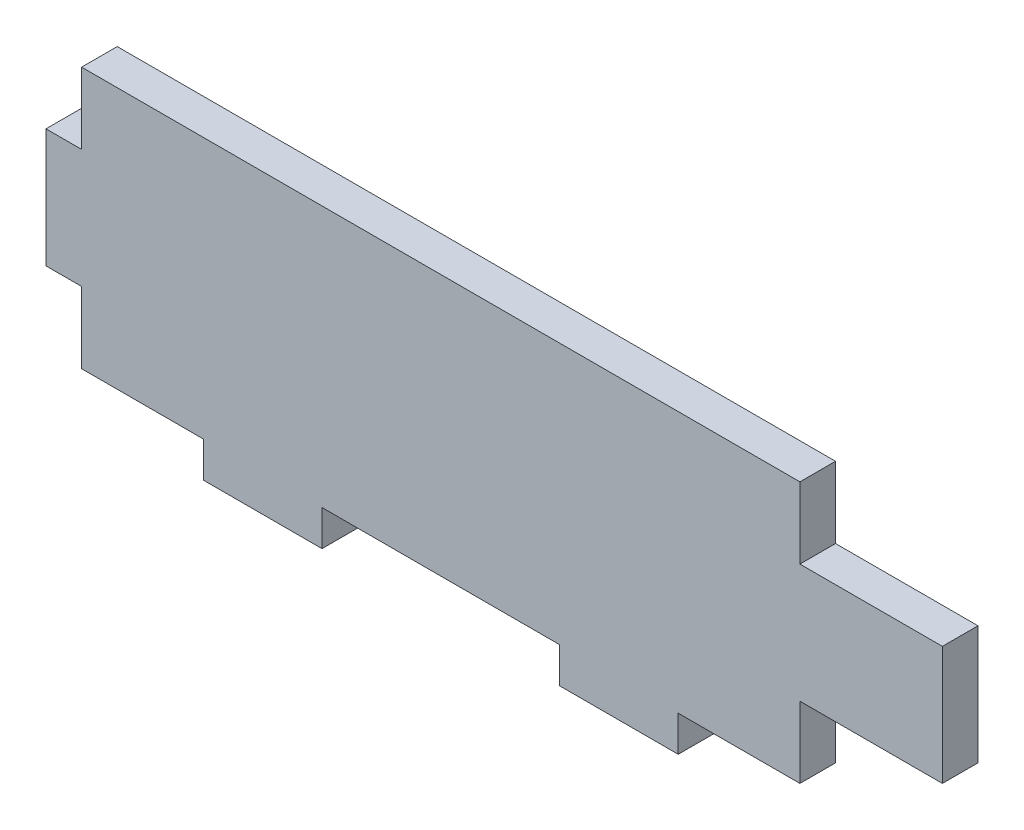
ISO-10303-21;
HEADER;
FILE_DESCRIPTION(('STEP AP214'),'2;1');
FILE_NAME('part.step','',(''),(''),'','','');
FILE_SCHEMA(('AUTOMOTIVE_DESIGN { 1 0 10303 214 1 1 1 1 }'));
ENDSEC;
DATA;
#1=APPLICATION_CONTEXT('core data for automotive mechanical design processes');
#2=APPLICATION_PROTOCOL_DEFINITION('international standard','automotive_design',2000,#1);
#3=PRODUCT_CONTEXT('',#1,'mechanical');
#4=PRODUCT('Part','Part','',(#3));
#5=PRODUCT_RELATED_PRODUCT_CATEGORY('part','',(#4));
#6=PRODUCT_DEFINITION_FORMATION('','',#4);
#7=PRODUCT_DEFINITION_CONTEXT('part definition',#1,'design');
#8=PRODUCT_DEFINITION('design','',#6,#7);
#9=PRODUCT_DEFINITION_SHAPE('','',#8);
#10=(LENGTH_UNIT() NAMED_UNIT(*) SI_UNIT(.MILLI.,.METRE.));
#11=(NAMED_UNIT(*) PLANE_ANGLE_UNIT() SI_UNIT($,.RADIAN.));
#12=(NAMED_UNIT(*) SI_UNIT($,.STERADIAN.) SOLID_ANGLE_UNIT());
#13=UNCERTAINTY_MEASURE_WITH_UNIT(LENGTH_MEASURE(1.E-05),#10,'distance_accuracy_value','');
#14=(GEOMETRIC_REPRESENTATION_CONTEXT(3) GLOBAL_UNCERTAINTY_ASSIGNED_CONTEXT((#13)) GLOBAL_UNIT_ASSIGNED_CONTEXT((#10,
#11,#12)) REPRESENTATION_CONTEXT('',''));
#15=CARTESIAN_POINT('',(0.,0.,0.));
#16=DIRECTION('',(0.,0.,1.));
#17=DIRECTION('',(1.,0.,0.));
#18=AXIS2_PLACEMENT_3D('',#15,#16,#17);
#19=CARTESIAN_POINT('',(-30.25,5.,3.));
#20=DIRECTION('',(1.,0.,0.));
#21=DIRECTION('',(0.,0.,-1.));
#22=AXIS2_PLACEMENT_3D('',#19,#20,#21);
#23=PLANE('',#22);
#24=DIRECTION('',(0.,-1.,0.));
#25=VECTOR('',#24,1.);
#26=CARTESIAN_POINT('',(-30.25,5.,0.));
#27=LINE('',#26,#25);
#28=CARTESIAN_POINT('',(-30.25,11.,0.));
#29=VERTEX_POINT('',#28);
#30=CARTESIAN_POINT('',(-30.25,5.,0.));
#31=VERTEX_POINT('',#30);
#32=EDGE_CURVE('E203',#29,#31,#27,.T.);
#33=ORIENTED_EDGE('',*,*,#32,.T.);
#34=DIRECTION('',(0.,0.,-1.));
#35=VECTOR('',#34,1.);
#36=CARTESIAN_POINT('',(-30.25,5.,3.));
#37=LINE('',#36,#35);
#38=CARTESIAN_POINT('',(-30.25,5.,3.));
#39=VERTEX_POINT('',#38);
#40=EDGE_CURVE('E11',#39,#31,#37,.T.);
#41=ORIENTED_EDGE('',*,*,#40,.F.);
#42=DIRECTION('',(0.,-1.,0.));
#43=VECTOR('',#42,1.);
#44=CARTESIAN_POINT('',(-30.25,5.,3.));
#45=LINE('',#44,#43);
#46=CARTESIAN_POINT('',(-30.25,11.,3.));
#47=VERTEX_POINT('',#46);
#48=EDGE_CURVE('E241',#47,#39,#45,.T.);
#49=ORIENTED_EDGE('',*,*,#48,.F.);
#50=DIRECTION('',(0.,0.,-1.));
#51=VECTOR('',#50,1.);
#52=CARTESIAN_POINT('',(-30.25,11.,3.));
#53=LINE('',#52,#51);
#54=EDGE_CURVE('E199',#47,#29,#53,.T.);
#55=ORIENTED_EDGE('',*,*,#54,.T.);
#56=EDGE_LOOP('',(#33,#41,#49,#55));
#57=FACE_BOUND('',#56,.T.);
#58=ADVANCED_FACE('F33',(#57),#23,.F.);
#59=CARTESIAN_POINT('',(-33.25,5.,3.));
#60=DIRECTION('',(0.,-1.,0.));
#61=DIRECTION('',(0.,0.,-1.));
#62=AXIS2_PLACEMENT_3D('',#59,#60,#61);
#63=PLANE('',#62);
#64=DIRECTION('',(-1.,0.,0.));
#65=VECTOR('',#64,1.);
#66=CARTESIAN_POINT('',(-33.25,5.,0.));
#67=LINE('',#66,#65);
#68=CARTESIAN_POINT('',(-33.25,5.,0.));
#69=VERTEX_POINT('',#68);
#70=EDGE_CURVE('E206',#31,#69,#67,.T.);
#71=ORIENTED_EDGE('',*,*,#70,.T.);
#72=DIRECTION('',(0.,0.,-1.));
#73=VECTOR('',#72,1.);
#74=CARTESIAN_POINT('',(-33.25,5.,3.));
#75=LINE('',#74,#73);
#76=CARTESIAN_POINT('',(-33.25,5.,3.));
#77=VERTEX_POINT('',#76);
#78=EDGE_CURVE('E40',#77,#69,#75,.T.);
#79=ORIENTED_EDGE('',*,*,#78,.F.);
#80=DIRECTION('',(-1.,0.,0.));
#81=VECTOR('',#80,1.);
#82=CARTESIAN_POINT('',(-33.25,5.,3.));
#83=LINE('',#82,#81);
#84=EDGE_CURVE('E127',#39,#77,#83,.T.);
#85=ORIENTED_EDGE('',*,*,#84,.F.);
#86=ORIENTED_EDGE('',*,*,#40,.T.);
#87=EDGE_LOOP('',(#71,#79,#85,#86));
#88=FACE_BOUND('',#87,.T.);
#89=ADVANCED_FACE('F346',(#88),#63,.F.);
#90=CARTESIAN_POINT('',(-33.25,-5.,3.));
#91=DIRECTION('',(1.,0.,0.));
#92=DIRECTION('',(0.,0.,-1.));
#93=AXIS2_PLACEMENT_3D('',#90,#91,#92);
#94=PLANE('',#93);
#95=DIRECTION('',(0.,-1.,0.));
#96=VECTOR('',#95,1.);
#97=CARTESIAN_POINT('',(-33.25,-5.,0.));
#98=LINE('',#97,#96);
#99=CARTESIAN_POINT('',(-33.25,-5.,0.));
#100=VERTEX_POINT('',#99);
#101=EDGE_CURVE('E208',#69,#100,#98,.T.);
#102=ORIENTED_EDGE('',*,*,#101,.T.);
#103=DIRECTION('',(0.,0.,-1.));
#104=VECTOR('',#103,1.);
#105=CARTESIAN_POINT('',(-33.25,-5.,3.));
#106=LINE('',#105,#104);
#107=CARTESIAN_POINT('',(-33.25,-5.,3.));
#108=VERTEX_POINT('',#107);
#109=EDGE_CURVE('E279',#108,#100,#106,.T.);
#110=ORIENTED_EDGE('',*,*,#109,.F.);
#111=DIRECTION('',(0.,-1.,0.));
#112=VECTOR('',#111,1.);
#113=CARTESIAN_POINT('',(-33.25,-5.,3.));
#114=LINE('',#113,#112);
#115=EDGE_CURVE('E287',#77,#108,#114,.T.);
#116=ORIENTED_EDGE('',*,*,#115,.F.);
#117=ORIENTED_EDGE('',*,*,#78,.T.);
#118=EDGE_LOOP('',(#102,#110,#116,#117));
#119=FACE_BOUND('',#118,.T.);
#120=ADVANCED_FACE('F285',(#119),#94,.F.);
#121=CARTESIAN_POINT('',(-30.25,-5.,3.));
#122=DIRECTION('',(0.,1.,0.));
#123=DIRECTION('',(0.,0.,1.));
#124=AXIS2_PLACEMENT_3D('',#121,#122,#123);
#125=PLANE('',#124);
#126=DIRECTION('',(1.,0.,0.));
#127=VECTOR('',#126,1.);
#128=CARTESIAN_POINT('',(-30.25,-5.,0.));
#129=LINE('',#128,#127);
#130=CARTESIAN_POINT('',(-30.25,-5.,0.));
#131=VERTEX_POINT('',#130);
#132=EDGE_CURVE('E210',#100,#131,#129,.T.);
#133=ORIENTED_EDGE('',*,*,#132,.T.);
#134=DIRECTION('',(0.,0.,-1.));
#135=VECTOR('',#134,1.);
#136=CARTESIAN_POINT('',(-30.25,-5.,3.));
#137=LINE('',#136,#135);
#138=CARTESIAN_POINT('',(-30.25,-5.,3.));
#139=VERTEX_POINT('',#138);
#140=EDGE_CURVE('E276',#139,#131,#137,.T.);
#141=ORIENTED_EDGE('',*,*,#140,.F.);
#142=DIRECTION('',(1.,0.,0.));
#143=VECTOR('',#142,1.);
#144=CARTESIAN_POINT('',(-30.25,-5.,3.));
#145=LINE('',#144,#143);
#146=EDGE_CURVE('E305',#108,#139,#145,.T.);
#147=ORIENTED_EDGE('',*,*,#146,.F.);
#148=ORIENTED_EDGE('',*,*,#109,.T.);
#149=EDGE_LOOP('',(#133,#141,#147,#148));
#150=FACE_BOUND('',#149,.T.);
#151=ADVANCED_FACE('F296',(#150),#125,.F.);
#152=CARTESIAN_POINT('',(-30.25,-11.,3.));
#153=DIRECTION('',(1.,0.,0.));
#154=DIRECTION('',(0.,0.,-1.));
#155=AXIS2_PLACEMENT_3D('',#152,#153,#154);
#156=PLANE('',#155);
#157=DIRECTION('',(0.,-1.,0.));
#158=VECTOR('',#157,1.);
#159=CARTESIAN_POINT('',(-30.25,-11.,0.));
#160=LINE('',#159,#158);
#161=CARTESIAN_POINT('',(-30.25,-11.,0.));
#162=VERTEX_POINT('',#161);
#163=EDGE_CURVE('E212',#131,#162,#160,.T.);
#164=ORIENTED_EDGE('',*,*,#163,.T.);
#165=DIRECTION('',(0.,0.,-1.));
#166=VECTOR('',#165,1.);
#167=CARTESIAN_POINT('',(-30.25,-11.,3.));
#168=LINE('',#167,#166);
#169=CARTESIAN_POINT('',(-30.25,-11.,3.));
#170=VERTEX_POINT('',#169);
#171=EDGE_CURVE('E273',#170,#162,#168,.T.);
#172=ORIENTED_EDGE('',*,*,#171,.F.);
#173=DIRECTION('',(0.,-1.,0.));
#174=VECTOR('',#173,1.);
#175=CARTESIAN_POINT('',(-30.25,-11.,3.));
#176=LINE('',#175,#174);
#177=EDGE_CURVE('E302',#139,#170,#176,.T.);
#178=ORIENTED_EDGE('',*,*,#177,.F.);
#179=ORIENTED_EDGE('',*,*,#140,.T.);
#180=EDGE_LOOP('',(#164,#172,#178,#179));
#181=FACE_BOUND('',#180,.T.);
#182=ADVANCED_FACE('F300',(#181),#156,.F.);
#183=CARTESIAN_POINT('',(-20.,-11.,3.));
#184=DIRECTION('',(0.,1.,0.));
#185=DIRECTION('',(-1.,0.,0.));
#186=AXIS2_PLACEMENT_3D('',#183,#184,#185);
#187=PLANE('',#186);
#188=DIRECTION('',(1.,0.,0.));
#189=VECTOR('',#188,1.);
#190=CARTESIAN_POINT('',(-20.,-11.,0.));
#191=LINE('',#190,#189);
#192=CARTESIAN_POINT('',(-20.,-11.,0.));
#193=VERTEX_POINT('',#192);
#194=EDGE_CURVE('E214',#162,#193,#191,.T.);
#195=ORIENTED_EDGE('',*,*,#194,.T.);
#196=DIRECTION('',(0.,0.,-1.));
#197=VECTOR('',#196,1.);
#198=CARTESIAN_POINT('',(-20.,-11.,3.));
#199=LINE('',#198,#197);
#200=CARTESIAN_POINT('',(-20.,-11.,3.));
#201=VERTEX_POINT('',#200);
#202=EDGE_CURVE('E270',#201,#193,#199,.T.);
#203=ORIENTED_EDGE('',*,*,#202,.F.);
#204=DIRECTION('',(1.,0.,0.));
#205=VECTOR('',#204,1.);
#206=CARTESIAN_POINT('',(-20.,-11.,3.));
#207=LINE('',#206,#205);
#208=EDGE_CURVE('E304',#170,#201,#207,.T.);
#209=ORIENTED_EDGE('',*,*,#208,.F.);
#210=ORIENTED_EDGE('',*,*,#171,.T.);
#211=EDGE_LOOP('',(#195,#203,#209,#210));
#212=FACE_BOUND('',#211,.T.);
#213=ADVANCED_FACE('F358',(#212),#187,.F.);
#214=CARTESIAN_POINT('',(-20.,-14.,3.));
#215=DIRECTION('',(1.,0.,0.));
#216=DIRECTION('',(0.,0.,-1.));
#217=AXIS2_PLACEMENT_3D('',#214,#215,#216);
#218=PLANE('',#217);
#219=DIRECTION('',(0.,-1.,0.));
#220=VECTOR('',#219,1.);
#221=CARTESIAN_POINT('',(-20.,-14.,0.));
#222=LINE('',#221,#220);
#223=CARTESIAN_POINT('',(-20.,-14.,0.));
#224=VERTEX_POINT('',#223);
#225=EDGE_CURVE('E216',#193,#224,#222,.T.);
#226=ORIENTED_EDGE('',*,*,#225,.T.);
#227=DIRECTION('',(0.,0.,-1.));
#228=VECTOR('',#227,1.);
#229=CARTESIAN_POINT('',(-20.,-14.,3.));
#230=LINE('',#229,#228);
#231=CARTESIAN_POINT('',(-20.,-14.,3.));
#232=VERTEX_POINT('',#231);
#233=EDGE_CURVE('E267',#232,#224,#230,.T.);
#234=ORIENTED_EDGE('',*,*,#233,.F.);
#235=DIRECTION('',(0.,-1.,0.));
#236=VECTOR('',#235,1.);
#237=CARTESIAN_POINT('',(-20.,-14.,3.));
#238=LINE('',#237,#236);
#239=EDGE_CURVE('E307',#201,#232,#238,.T.);
#240=ORIENTED_EDGE('',*,*,#239,.F.);
#241=ORIENTED_EDGE('',*,*,#202,.T.);
#242=EDGE_LOOP('',(#226,#234,#240,#241));
#243=FACE_BOUND('',#242,.T.);
#244=ADVANCED_FACE('F361',(#243),#218,.F.);
#245=CARTESIAN_POINT('',(-10.,-14.,3.));
#246=DIRECTION('',(0.,1.,0.));
#247=DIRECTION('',(0.,0.,1.));
#248=AXIS2_PLACEMENT_3D('',#245,#246,#247);
#249=PLANE('',#248);
#250=DIRECTION('',(1.,0.,0.));
#251=VECTOR('',#250,1.);
#252=CARTESIAN_POINT('',(-10.,-14.,0.));
#253=LINE('',#252,#251);
#254=CARTESIAN_POINT('',(-10.,-14.,0.));
#255=VERTEX_POINT('',#254);
#256=EDGE_CURVE('E218',#224,#255,#253,.T.);
#257=ORIENTED_EDGE('',*,*,#256,.T.);
#258=DIRECTION('',(0.,0.,-1.));
#259=VECTOR('',#258,1.);
#260=CARTESIAN_POINT('',(-10.,-14.,3.));
#261=LINE('',#260,#259);
#262=CARTESIAN_POINT('',(-10.,-14.,3.));
#263=VERTEX_POINT('',#262);
#264=EDGE_CURVE('E264',#263,#255,#261,.T.);
#265=ORIENTED_EDGE('',*,*,#264,.F.);
#266=DIRECTION('',(1.,0.,0.));
#267=VECTOR('',#266,1.);
#268=CARTESIAN_POINT('',(-10.,-14.,3.));
#269=LINE('',#268,#267);
#270=EDGE_CURVE('E313',#232,#263,#269,.T.);
#271=ORIENTED_EDGE('',*,*,#270,.F.);
#272=ORIENTED_EDGE('',*,*,#233,.T.);
#273=EDGE_LOOP('',(#257,#265,#271,#272));
#274=FACE_BOUND('',#273,.T.);
#275=ADVANCED_FACE('F365',(#274),#249,.F.);
#276=CARTESIAN_POINT('',(-10.,-11.,3.));
#277=DIRECTION('',(-1.,0.,0.));
#278=DIRECTION('',(0.,0.,1.));
#279=AXIS2_PLACEMENT_3D('',#276,#277,#278);
#280=PLANE('',#279);
#281=DIRECTION('',(0.,1.,0.));
#282=VECTOR('',#281,1.);
#283=CARTESIAN_POINT('',(-10.,-11.,0.));
#284=LINE('',#283,#282);
#285=CARTESIAN_POINT('',(-10.,-11.,0.));
#286=VERTEX_POINT('',#285);
#287=EDGE_CURVE('E220',#255,#286,#284,.T.);
#288=ORIENTED_EDGE('',*,*,#287,.T.);
#289=DIRECTION('',(0.,0.,-1.));
#290=VECTOR('',#289,1.);
#291=CARTESIAN_POINT('',(-10.,-11.,3.));
#292=LINE('',#291,#290);
#293=CARTESIAN_POINT('',(-10.,-11.,3.));
#294=VERTEX_POINT('',#293);
#295=EDGE_CURVE('E261',#294,#286,#292,.T.);
#296=ORIENTED_EDGE('',*,*,#295,.F.);
#297=DIRECTION('',(0.,1.,0.));
#298=VECTOR('',#297,1.);
#299=CARTESIAN_POINT('',(-10.,-11.,3.));
#300=LINE('',#299,#298);
#301=EDGE_CURVE('E315',#263,#294,#300,.T.);
#302=ORIENTED_EDGE('',*,*,#301,.F.);
#303=ORIENTED_EDGE('',*,*,#264,.T.);
#304=EDGE_LOOP('',(#288,#296,#302,#303));
#305=FACE_BOUND('',#304,.T.);
#306=ADVANCED_FACE('F369',(#305),#280,.F.);
#307=CARTESIAN_POINT('',(10.,-11.,3.));
#308=DIRECTION('',(0.,1.,0.));
#309=DIRECTION('',(-1.,0.,0.));
#310=AXIS2_PLACEMENT_3D('',#307,#308,#309);
#311=PLANE('',#310);
#312=DIRECTION('',(1.,0.,0.));
#313=VECTOR('',#312,1.);
#314=CARTESIAN_POINT('',(10.,-11.,0.));
#315=LINE('',#314,#313);
#316=CARTESIAN_POINT('',(10.,-11.,0.));
#317=VERTEX_POINT('',#316);
#318=EDGE_CURVE('E222',#286,#317,#315,.T.);
#319=ORIENTED_EDGE('',*,*,#318,.T.);
#320=DIRECTION('',(0.,0.,-1.));
#321=VECTOR('',#320,1.);
#322=CARTESIAN_POINT('',(10.,-11.,3.));
#323=LINE('',#322,#321);
#324=CARTESIAN_POINT('',(10.,-11.,3.));
#325=VERTEX_POINT('',#324);
#326=EDGE_CURVE('E258',#325,#317,#323,.T.);
#327=ORIENTED_EDGE('',*,*,#326,.F.);
#328=DIRECTION('',(1.,0.,0.));
#329=VECTOR('',#328,1.);
#330=CARTESIAN_POINT('',(10.,-11.,3.));
#331=LINE('',#330,#329);
#332=EDGE_CURVE('E317',#294,#325,#331,.T.);
#333=ORIENTED_EDGE('',*,*,#332,.F.);
#334=ORIENTED_EDGE('',*,*,#295,.T.);
#335=EDGE_LOOP('',(#319,#327,#333,#334));
#336=FACE_BOUND('',#335,.T.);
#337=ADVANCED_FACE('F373',(#336),#311,.F.);
#338=CARTESIAN_POINT('',(10.,-14.,3.));
#339=DIRECTION('',(1.,0.,0.));
#340=DIRECTION('',(0.,0.,-1.));
#341=AXIS2_PLACEMENT_3D('',#338,#339,#340);
#342=PLANE('',#341);
#343=DIRECTION('',(0.,-1.,0.));
#344=VECTOR('',#343,1.);
#345=CARTESIAN_POINT('',(10.,-14.,0.));
#346=LINE('',#345,#344);
#347=CARTESIAN_POINT('',(10.,-14.,0.));
#348=VERTEX_POINT('',#347);
#349=EDGE_CURVE('E224',#317,#348,#346,.T.);
#350=ORIENTED_EDGE('',*,*,#349,.T.);
#351=DIRECTION('',(0.,0.,-1.));
#352=VECTOR('',#351,1.);
#353=CARTESIAN_POINT('',(10.,-14.,3.));
#354=LINE('',#353,#352);
#355=CARTESIAN_POINT('',(10.,-14.,3.));
#356=VERTEX_POINT('',#355);
#357=EDGE_CURVE('E255',#356,#348,#354,.T.);
#358=ORIENTED_EDGE('',*,*,#357,.F.);
#359=DIRECTION('',(0.,-1.,0.));
#360=VECTOR('',#359,1.);
#361=CARTESIAN_POINT('',(10.,-14.,3.));
#362=LINE('',#361,#360);
#363=EDGE_CURVE('E319',#325,#356,#362,.T.);
#364=ORIENTED_EDGE('',*,*,#363,.F.);
#365=ORIENTED_EDGE('',*,*,#326,.T.);
#366=EDGE_LOOP('',(#350,#358,#364,#365));
#367=FACE_BOUND('',#366,.T.);
#368=ADVANCED_FACE('F377',(#367),#342,.F.);
#369=CARTESIAN_POINT('',(20.,-14.,3.));
#370=DIRECTION('',(0.,1.,0.));
#371=DIRECTION('',(-1.,0.,0.));
#372=AXIS2_PLACEMENT_3D('',#369,#370,#371);
#373=PLANE('',#372);
#374=DIRECTION('',(1.,0.,0.));
#375=VECTOR('',#374,1.);
#376=CARTESIAN_POINT('',(20.,-14.,0.));
#377=LINE('',#376,#375);
#378=CARTESIAN_POINT('',(20.,-14.,0.));
#379=VERTEX_POINT('',#378);
#380=EDGE_CURVE('E226',#348,#379,#377,.T.);
#381=ORIENTED_EDGE('',*,*,#380,.T.);
#382=DIRECTION('',(0.,0.,-1.));
#383=VECTOR('',#382,1.);
#384=CARTESIAN_POINT('',(20.,-14.,3.));
#385=LINE('',#384,#383);
#386=CARTESIAN_POINT('',(20.,-14.,3.));
#387=VERTEX_POINT('',#386);
#388=EDGE_CURVE('E252',#387,#379,#385,.T.);
#389=ORIENTED_EDGE('',*,*,#388,.F.);
#390=DIRECTION('',(1.,0.,0.));
#391=VECTOR('',#390,1.);
#392=CARTESIAN_POINT('',(20.,-14.,3.));
#393=LINE('',#392,#391);
#394=EDGE_CURVE('E321',#356,#387,#393,.T.);
#395=ORIENTED_EDGE('',*,*,#394,.F.);
#396=ORIENTED_EDGE('',*,*,#357,.T.);
#397=EDGE_LOOP('',(#381,#389,#395,#396));
#398=FACE_BOUND('',#397,.T.);
#399=ADVANCED_FACE('F381',(#398),#373,.F.);
#400=CARTESIAN_POINT('',(20.,-11.,3.));
#401=DIRECTION('',(-1.,0.,0.));
#402=DIRECTION('',(0.,0.,1.));
#403=AXIS2_PLACEMENT_3D('',#400,#401,#402);
#404=PLANE('',#403);
#405=DIRECTION('',(0.,1.,0.));
#406=VECTOR('',#405,1.);
#407=CARTESIAN_POINT('',(20.,-11.,0.));
#408=LINE('',#407,#406);
#409=CARTESIAN_POINT('',(20.,-11.,0.));
#410=VERTEX_POINT('',#409);
#411=EDGE_CURVE('E228',#379,#410,#408,.T.);
#412=ORIENTED_EDGE('',*,*,#411,.T.);
#413=DIRECTION('',(0.,0.,-1.));
#414=VECTOR('',#413,1.);
#415=CARTESIAN_POINT('',(20.,-11.,3.));
#416=LINE('',#415,#414);
#417=CARTESIAN_POINT('',(20.,-11.,3.));
#418=VERTEX_POINT('',#417);
#419=EDGE_CURVE('E249',#418,#410,#416,.T.);
#420=ORIENTED_EDGE('',*,*,#419,.F.);
#421=DIRECTION('',(0.,1.,0.));
#422=VECTOR('',#421,1.);
#423=CARTESIAN_POINT('',(20.,-11.,3.));
#424=LINE('',#423,#422);
#425=EDGE_CURVE('E323',#387,#418,#424,.T.);
#426=ORIENTED_EDGE('',*,*,#425,.F.);
#427=ORIENTED_EDGE('',*,*,#388,.T.);
#428=EDGE_LOOP('',(#412,#420,#426,#427));
#429=FACE_BOUND('',#428,.T.);
#430=ADVANCED_FACE('F385',(#429),#404,.F.);
#431=CARTESIAN_POINT('',(30.25,-11.,3.));
#432=DIRECTION('',(0.,1.,0.));
#433=DIRECTION('',(0.,0.,1.));
#434=AXIS2_PLACEMENT_3D('',#431,#432,#433);
#435=PLANE('',#434);
#436=DIRECTION('',(1.,0.,0.));
#437=VECTOR('',#436,1.);
#438=CARTESIAN_POINT('',(30.25,-11.,0.));
#439=LINE('',#438,#437);
#440=CARTESIAN_POINT('',(30.25,-11.,0.));
#441=VERTEX_POINT('',#440);
#442=EDGE_CURVE('E230',#410,#441,#439,.T.);
#443=ORIENTED_EDGE('',*,*,#442,.T.);
#444=DIRECTION('',(0.,0.,-1.));
#445=VECTOR('',#444,1.);
#446=CARTESIAN_POINT('',(30.25,-11.,3.));
#447=LINE('',#446,#445);
#448=CARTESIAN_POINT('',(30.25,-11.,3.));
#449=VERTEX_POINT('',#448);
#450=EDGE_CURVE('E246',#449,#441,#447,.T.);
#451=ORIENTED_EDGE('',*,*,#450,.F.);
#452=DIRECTION('',(1.,0.,0.));
#453=VECTOR('',#452,1.);
#454=CARTESIAN_POINT('',(30.25,-11.,3.));
#455=LINE('',#454,#453);
#456=EDGE_CURVE('E325',#418,#449,#455,.T.);
#457=ORIENTED_EDGE('',*,*,#456,.F.);
#458=ORIENTED_EDGE('',*,*,#419,.T.);
#459=EDGE_LOOP('',(#443,#451,#457,#458));
#460=FACE_BOUND('',#459,.T.);
#461=ADVANCED_FACE('F389',(#460),#435,.F.);
#462=CARTESIAN_POINT('',(30.25,-5.,3.));
#463=DIRECTION('',(-1.,0.,0.));
#464=DIRECTION('',(0.,0.,1.));
#465=AXIS2_PLACEMENT_3D('',#462,#463,#464);
#466=PLANE('',#465);
#467=DIRECTION('',(0.,1.,0.));
#468=VECTOR('',#467,1.);
#469=CARTESIAN_POINT('',(30.25,-5.,0.));
#470=LINE('',#469,#468);
#471=CARTESIAN_POINT('',(30.25,-5.,0.));
#472=VERTEX_POINT('',#471);
#473=EDGE_CURVE('E232',#441,#472,#470,.T.);
#474=ORIENTED_EDGE('',*,*,#473,.T.);
#475=DIRECTION('',(0.,0.,-1.));
#476=VECTOR('',#475,1.);
#477=CARTESIAN_POINT('',(30.25,-5.,3.));
#478=LINE('',#477,#476);
#479=CARTESIAN_POINT('',(30.25,-5.,3.));
#480=VERTEX_POINT('',#479);
#481=EDGE_CURVE('E194',#480,#472,#478,.T.);
#482=ORIENTED_EDGE('',*,*,#481,.F.);
#483=DIRECTION('',(0.,1.,0.));
#484=VECTOR('',#483,1.);
#485=CARTESIAN_POINT('',(30.25,-5.,3.));
#486=LINE('',#485,#484);
#487=EDGE_CURVE('E327',#449,#480,#486,.T.);
#488=ORIENTED_EDGE('',*,*,#487,.F.);
#489=ORIENTED_EDGE('',*,*,#450,.T.);
#490=EDGE_LOOP('',(#474,#482,#488,#489));
#491=FACE_BOUND('',#490,.T.);
#492=ADVANCED_FACE('F393',(#491),#466,.F.);
#493=CARTESIAN_POINT('',(45.25,-5.,3.));
#494=DIRECTION('',(0.,1.,0.));
#495=DIRECTION('',(0.,0.,1.));
#496=AXIS2_PLACEMENT_3D('',#493,#494,#495);
#497=PLANE('',#496);
#498=DIRECTION('',(1.,0.,0.));
#499=VECTOR('',#498,1.);
#500=CARTESIAN_POINT('',(45.25,-5.,0.));
#501=LINE('',#500,#499);
#502=CARTESIAN_POINT('',(42.25,-5.,0.));
#503=VERTEX_POINT('',#502);
#504=EDGE_CURVE('E234',#472,#503,#501,.T.);
#505=ORIENTED_EDGE('',*,*,#504,.T.);
#506=DIRECTION('',(0.,0.,1.));
#507=VECTOR('',#506,1.);
#508=CARTESIAN_POINT('',(42.25,-5.,0.));
#509=LINE('',#508,#507);
#510=CARTESIAN_POINT('',(42.25,-5.,3.));
#511=VERTEX_POINT('',#510);
#512=EDGE_CURVE('E47',#503,#511,#509,.T.);
#513=ORIENTED_EDGE('',*,*,#512,.T.);
#514=DIRECTION('',(1.,0.,0.));
#515=VECTOR('',#514,1.);
#516=CARTESIAN_POINT('',(45.25,-5.,3.));
#517=LINE('',#516,#515);
#518=EDGE_CURVE('E185',#480,#511,#517,.T.);
#519=ORIENTED_EDGE('',*,*,#518,.F.);
#520=ORIENTED_EDGE('',*,*,#481,.T.);
#521=EDGE_LOOP('',(#505,#513,#519,#520));
#522=FACE_BOUND('',#521,.T.);
#523=ADVANCED_FACE('F332',(#522),#497,.F.);
#524=CARTESIAN_POINT('',(30.25,5.,3.));
#525=DIRECTION('',(0.,-1.,0.));
#526=DIRECTION('',(0.,0.,-1.));
#527=AXIS2_PLACEMENT_3D('',#524,#525,#526);
#528=PLANE('',#527);
#529=DIRECTION('',(-1.,0.,0.));
#530=VECTOR('',#529,1.);
#531=CARTESIAN_POINT('',(30.25,5.,3.));
#532=LINE('',#531,#530);
#533=CARTESIAN_POINT('',(42.25,5.,3.));
#534=VERTEX_POINT('',#533);
#535=CARTESIAN_POINT('',(30.25,5.,3.));
#536=VERTEX_POINT('',#535);
#537=EDGE_CURVE('E174',#534,#536,#532,.T.);
#538=ORIENTED_EDGE('',*,*,#537,.F.);
#539=DIRECTION('',(0.,0.,1.));
#540=VECTOR('',#539,1.);
#541=CARTESIAN_POINT('',(42.25,5.,0.));
#542=LINE('',#541,#540);
#543=CARTESIAN_POINT('',(42.25,5.,0.));
#544=VERTEX_POINT('',#543);
#545=EDGE_CURVE('E334',#544,#534,#542,.T.);
#546=ORIENTED_EDGE('',*,*,#545,.F.);
#547=DIRECTION('',(-1.,0.,0.));
#548=VECTOR('',#547,1.);
#549=CARTESIAN_POINT('',(30.25,5.,0.));
#550=LINE('',#549,#548);
#551=CARTESIAN_POINT('',(30.25,5.,0.));
#552=VERTEX_POINT('',#551);
#553=EDGE_CURVE('E191',#544,#552,#550,.T.);
#554=ORIENTED_EDGE('',*,*,#553,.T.);
#555=DIRECTION('',(0.,0.,-1.));
#556=VECTOR('',#555,1.);
#557=CARTESIAN_POINT('',(30.25,5.,3.));
#558=LINE('',#557,#556);
#559=EDGE_CURVE('E188',#536,#552,#558,.T.);
#560=ORIENTED_EDGE('',*,*,#559,.F.);
#561=EDGE_LOOP('',(#538,#546,#554,#560));
#562=FACE_BOUND('',#561,.T.);
#563=ADVANCED_FACE('F189',(#562),#528,.F.);
#564=CARTESIAN_POINT('',(30.25,11.,3.));
#565=DIRECTION('',(-1.,0.,0.));
#566=DIRECTION('',(0.,0.,1.));
#567=AXIS2_PLACEMENT_3D('',#564,#565,#566);
#568=PLANE('',#567);
#569=DIRECTION('',(0.,1.,0.));
#570=VECTOR('',#569,1.);
#571=CARTESIAN_POINT('',(30.25,11.,0.));
#572=LINE('',#571,#570);
#573=CARTESIAN_POINT('',(30.25,11.,0.));
#574=VERTEX_POINT('',#573);
#575=EDGE_CURVE('E238',#552,#574,#572,.T.);
#576=ORIENTED_EDGE('',*,*,#575,.T.);
#577=DIRECTION('',(0.,0.,-1.));
#578=VECTOR('',#577,1.);
#579=CARTESIAN_POINT('',(30.25,11.,3.));
#580=LINE('',#579,#578);
#581=CARTESIAN_POINT('',(30.25,11.,3.));
#582=VERTEX_POINT('',#581);
#583=EDGE_CURVE('E195',#582,#574,#580,.T.);
#584=ORIENTED_EDGE('',*,*,#583,.F.);
#585=DIRECTION('',(0.,1.,0.));
#586=VECTOR('',#585,1.);
#587=CARTESIAN_POINT('',(30.25,11.,3.));
#588=LINE('',#587,#586);
#589=EDGE_CURVE('E179',#536,#582,#588,.T.);
#590=ORIENTED_EDGE('',*,*,#589,.F.);
#591=ORIENTED_EDGE('',*,*,#559,.T.);
#592=EDGE_LOOP('',(#576,#584,#590,#591));
#593=FACE_BOUND('',#592,.T.);
#594=ADVANCED_FACE('F197',(#593),#568,.F.);
#595=CARTESIAN_POINT('',(-30.25,11.,3.));
#596=DIRECTION('',(0.,-1.,0.));
#597=DIRECTION('',(0.,0.,-1.));
#598=AXIS2_PLACEMENT_3D('',#595,#596,#597);
#599=PLANE('',#598);
#600=DIRECTION('',(-1.,0.,0.));
#601=VECTOR('',#600,1.);
#602=CARTESIAN_POINT('',(-30.25,11.,0.));
#603=LINE('',#602,#601);
#604=EDGE_CURVE('E119',#574,#29,#603,.T.);
#605=ORIENTED_EDGE('',*,*,#604,.T.);
#606=ORIENTED_EDGE('',*,*,#54,.F.);
#607=DIRECTION('',(-1.,0.,0.));
#608=VECTOR('',#607,1.);
#609=CARTESIAN_POINT('',(-30.25,11.,3.));
#610=LINE('',#609,#608);
#611=EDGE_CURVE('E56',#582,#47,#610,.T.);
#612=ORIENTED_EDGE('',*,*,#611,.F.);
#613=ORIENTED_EDGE('',*,*,#583,.T.);
#614=EDGE_LOOP('',(#605,#606,#612,#613));
#615=FACE_BOUND('',#614,.T.);
#616=ADVANCED_FACE('F404',(#615),#599,.F.);
#617=CARTESIAN_POINT('',(0.,0.,3.));
#618=DIRECTION('',(0.,0.,-1.));
#619=DIRECTION('',(-1.,0.,0.));
#620=AXIS2_PLACEMENT_3D('',#617,#618,#619);
#621=PLANE('',#620);
#622=ORIENTED_EDGE('',*,*,#518,.T.);
#623=DIRECTION('',(0.,-1.,0.));
#624=VECTOR('',#623,1.);
#625=CARTESIAN_POINT('',(42.25,5.,3.));
#626=LINE('',#625,#624);
#627=EDGE_CURVE('E182',#534,#511,#626,.T.);
#628=ORIENTED_EDGE('',*,*,#627,.F.);
#629=ORIENTED_EDGE('',*,*,#537,.T.);
#630=ORIENTED_EDGE('',*,*,#589,.T.);
#631=ORIENTED_EDGE('',*,*,#611,.T.);
#632=ORIENTED_EDGE('',*,*,#48,.T.);
#633=ORIENTED_EDGE('',*,*,#84,.T.);
#634=ORIENTED_EDGE('',*,*,#115,.T.);
#635=ORIENTED_EDGE('',*,*,#146,.T.);
#636=ORIENTED_EDGE('',*,*,#177,.T.);
#637=ORIENTED_EDGE('',*,*,#208,.T.);
#638=ORIENTED_EDGE('',*,*,#239,.T.);
#639=ORIENTED_EDGE('',*,*,#270,.T.);
#640=ORIENTED_EDGE('',*,*,#301,.T.);
#641=ORIENTED_EDGE('',*,*,#332,.T.);
#642=ORIENTED_EDGE('',*,*,#363,.T.);
#643=ORIENTED_EDGE('',*,*,#394,.T.);
#644=ORIENTED_EDGE('',*,*,#425,.T.);
#645=ORIENTED_EDGE('',*,*,#456,.T.);
#646=ORIENTED_EDGE('',*,*,#487,.T.);
#647=EDGE_LOOP('',(#622,#628,#629,#630,#631,#632,#633,#634,#635,#636,#637,#638,#639,#640,#641,
#642,#643,#644,#645,#646));
#648=FACE_BOUND('',#647,.T.);
#649=ADVANCED_FACE('F177',(#648),#621,.F.);
#650=CARTESIAN_POINT('',(0.,0.,0.));
#651=DIRECTION('',(0.,0.,-1.));
#652=DIRECTION('',(-1.,0.,0.));
#653=AXIS2_PLACEMENT_3D('',#650,#651,#652);
#654=PLANE('',#653);
#655=DIRECTION('',(0.,-1.,0.));
#656=VECTOR('',#655,1.);
#657=CARTESIAN_POINT('',(42.25,5.,0.));
#658=LINE('',#657,#656);
#659=EDGE_CURVE('E337',#544,#503,#658,.T.);
#660=ORIENTED_EDGE('',*,*,#659,.T.);
#661=ORIENTED_EDGE('',*,*,#504,.F.);
#662=ORIENTED_EDGE('',*,*,#473,.F.);
#663=ORIENTED_EDGE('',*,*,#442,.F.);
#664=ORIENTED_EDGE('',*,*,#411,.F.);
#665=ORIENTED_EDGE('',*,*,#380,.F.);
#666=ORIENTED_EDGE('',*,*,#349,.F.);
#667=ORIENTED_EDGE('',*,*,#318,.F.);
#668=ORIENTED_EDGE('',*,*,#287,.F.);
#669=ORIENTED_EDGE('',*,*,#256,.F.);
#670=ORIENTED_EDGE('',*,*,#225,.F.);
#671=ORIENTED_EDGE('',*,*,#194,.F.);
#672=ORIENTED_EDGE('',*,*,#163,.F.);
#673=ORIENTED_EDGE('',*,*,#132,.F.);
#674=ORIENTED_EDGE('',*,*,#101,.F.);
#675=ORIENTED_EDGE('',*,*,#70,.F.);
#676=ORIENTED_EDGE('',*,*,#32,.F.);
#677=ORIENTED_EDGE('',*,*,#604,.F.);
#678=ORIENTED_EDGE('',*,*,#575,.F.);
#679=ORIENTED_EDGE('',*,*,#553,.F.);
#680=EDGE_LOOP('',(#660,#661,#662,#663,#664,#665,#666,#667,#668,#669,#670,#671,#672,#673,#674,
#675,#676,#677,#678,#679));
#681=FACE_BOUND('',#680,.T.);
#682=ADVANCED_FACE('F290',(#681),#654,.T.);
#683=CARTESIAN_POINT('',(42.25,5.,0.));
#684=DIRECTION('',(-1.,0.,0.));
#685=DIRECTION('',(0.,0.,1.));
#686=AXIS2_PLACEMENT_3D('',#683,#684,#685);
#687=PLANE('',#686);
#688=ORIENTED_EDGE('',*,*,#627,.T.);
#689=ORIENTED_EDGE('',*,*,#512,.F.);
#690=ORIENTED_EDGE('',*,*,#659,.F.);
#691=ORIENTED_EDGE('',*,*,#545,.T.);
#692=EDGE_LOOP('',(#688,#689,#690,#691));
#693=FACE_BOUND('',#692,.T.);
#694=ADVANCED_FACE('F409',(#693),#687,.F.);
#695=CLOSED_SHELL('',(#58,#89,#120,#151,#182,#213,#244,#275,#306,#337,#368,#399,#430,#461,#492,
#523,#563,#594,#616,#649,#682,#694));
#696=MANIFOLD_SOLID_BREP('B2',#695);
#697=ADVANCED_BREP_SHAPE_REPRESENTATION('',(#18,#696),#14);
#698=SHAPE_DEFINITION_REPRESENTATION(#9,#697);
ENDSEC;
END-ISO-10303-21;
